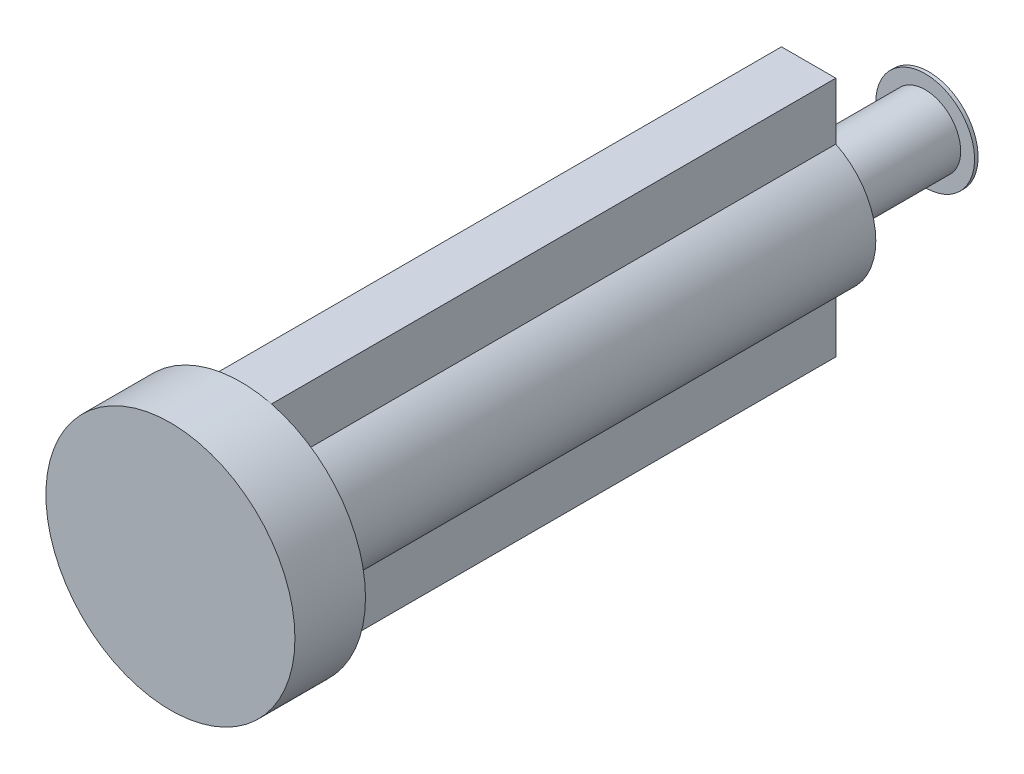
ISO-10303-21;
HEADER;
FILE_DESCRIPTION(('STEP AP214'),'2;1');
FILE_NAME('part.step','',(''),(''),'','','');
FILE_SCHEMA(('AUTOMOTIVE_DESIGN { 1 0 10303 214 1 1 1 1 }'));
ENDSEC;
DATA;
#1=APPLICATION_CONTEXT('core data for automotive mechanical design processes');
#2=APPLICATION_PROTOCOL_DEFINITION('international standard','automotive_design',2000,#1);
#3=PRODUCT_CONTEXT('',#1,'mechanical');
#4=PRODUCT('Part','Part','',(#3));
#5=PRODUCT_RELATED_PRODUCT_CATEGORY('part','',(#4));
#6=PRODUCT_DEFINITION_FORMATION('','',#4);
#7=PRODUCT_DEFINITION_CONTEXT('part definition',#1,'design');
#8=PRODUCT_DEFINITION('design','',#6,#7);
#9=PRODUCT_DEFINITION_SHAPE('','',#8);
#10=(LENGTH_UNIT() NAMED_UNIT(*) SI_UNIT(.MILLI.,.METRE.));
#11=(NAMED_UNIT(*) PLANE_ANGLE_UNIT() SI_UNIT($,.RADIAN.));
#12=(NAMED_UNIT(*) SI_UNIT($,.STERADIAN.) SOLID_ANGLE_UNIT());
#13=UNCERTAINTY_MEASURE_WITH_UNIT(LENGTH_MEASURE(1.E-05),#10,'distance_accuracy_value','');
#14=(GEOMETRIC_REPRESENTATION_CONTEXT(3) GLOBAL_UNCERTAINTY_ASSIGNED_CONTEXT((#13)) GLOBAL_UNIT_ASSIGNED_CONTEXT((#10,
#11,#12)) REPRESENTATION_CONTEXT('',''));
#15=CARTESIAN_POINT('',(0.,0.,0.));
#16=DIRECTION('',(0.,0.,1.));
#17=DIRECTION('',(1.,0.,0.));
#18=AXIS2_PLACEMENT_3D('',#15,#16,#17);
#19=CARTESIAN_POINT('',(-3.37132085295052,17.1145735807025,80.));
#20=DIRECTION('',(1.,0.,0.));
#21=DIRECTION('',(0.,0.,-1.));
#22=AXIS2_PLACEMENT_3D('',#19,#20,#21);
#23=PLANE('',#22);
#24=DIRECTION('',(0.,-1.,0.));
#25=VECTOR('',#24,1.);
#26=CARTESIAN_POINT('',(-3.37132085295052,17.1145735807025,0.));
#27=LINE('',#26,#25);
#28=CARTESIAN_POINT('',(-3.37132085295052,17.1145735807025,0.));
#29=VERTEX_POINT('',#28);
#30=CARTESIAN_POINT('',(-3.37132085295052,9.41457358070247,0.));
#31=VERTEX_POINT('',#30);
#32=EDGE_CURVE('E156',#29,#31,#27,.T.);
#33=ORIENTED_EDGE('',*,*,#32,.T.);
#34=DIRECTION('',(0.,0.,-1.));
#35=VECTOR('',#34,1.);
#36=CARTESIAN_POINT('',(-3.37132085295052,9.41457358070247,80.));
#37=LINE('',#36,#35);
#38=CARTESIAN_POINT('',(-3.37132085295052,9.41457358070247,80.));
#39=VERTEX_POINT('',#38);
#40=EDGE_CURVE('E48',#39,#31,#37,.T.);
#41=ORIENTED_EDGE('',*,*,#40,.F.);
#42=DIRECTION('',(0.,-1.,0.));
#43=VECTOR('',#42,1.);
#44=CARTESIAN_POINT('',(-3.37132085295052,17.1145735807025,80.));
#45=LINE('',#44,#43);
#46=CARTESIAN_POINT('',(-3.37132085295052,17.1145735807025,80.));
#47=VERTEX_POINT('',#46);
#48=EDGE_CURVE('E179',#47,#39,#45,.T.);
#49=ORIENTED_EDGE('',*,*,#48,.F.);
#50=DIRECTION('',(0.,0.,-1.));
#51=VECTOR('',#50,1.);
#52=CARTESIAN_POINT('',(-3.37132085295052,17.1145735807025,80.));
#53=LINE('',#52,#51);
#54=EDGE_CURVE('E155',#47,#29,#53,.T.);
#55=ORIENTED_EDGE('',*,*,#54,.T.);
#56=EDGE_LOOP('',(#33,#41,#49,#55));
#57=FACE_BOUND('',#56,.T.);
#58=ADVANCED_FACE('F39',(#57),#23,.F.);
#59=CARTESIAN_POINT('',(0.,0.,80.));
#60=DIRECTION('',(0.,0.,-1.));
#61=DIRECTION('',(-1.,0.,0.));
#62=AXIS2_PLACEMENT_3D('',#59,#60,#61);
#63=CYLINDRICAL_SURFACE('',#62,10.);
#64=CARTESIAN_POINT('',(0.,0.,0.));
#65=DIRECTION('',(0.,0.,1.));
#66=DIRECTION('',(1.,0.,0.));
#67=AXIS2_PLACEMENT_3D('',#64,#65,#66);
#68=CIRCLE('',#67,10.);
#69=CARTESIAN_POINT('',(-3.37132085295052,-9.41457358070247,0.));
#70=VERTEX_POINT('',#69);
#71=EDGE_CURVE('E160',#31,#70,#68,.T.);
#72=ORIENTED_EDGE('',*,*,#71,.T.);
#73=DIRECTION('',(0.,0.,-1.));
#74=VECTOR('',#73,1.);
#75=CARTESIAN_POINT('',(-3.37132085295052,-9.41457358070247,80.));
#76=LINE('',#75,#74);
#77=CARTESIAN_POINT('',(-3.37132085295052,-9.41457358070247,80.));
#78=VERTEX_POINT('',#77);
#79=EDGE_CURVE('E192',#78,#70,#76,.T.);
#80=ORIENTED_EDGE('',*,*,#79,.F.);
#81=CARTESIAN_POINT('',(0.,0.,80.));
#82=DIRECTION('',(0.,0.,1.));
#83=DIRECTION('',(1.,0.,0.));
#84=AXIS2_PLACEMENT_3D('',#81,#82,#83);
#85=CIRCLE('',#84,10.);
#86=EDGE_CURVE('E99',#39,#78,#85,.T.);
#87=ORIENTED_EDGE('',*,*,#86,.F.);
#88=ORIENTED_EDGE('',*,*,#40,.T.);
#89=EDGE_LOOP('',(#72,#80,#87,#88));
#90=FACE_BOUND('',#89,.T.);
#91=ADVANCED_FACE('F196',(#90),#63,.T.);
#92=CARTESIAN_POINT('',(-3.37132085295052,-9.41457358070247,80.));
#93=DIRECTION('',(1.,0.,0.));
#94=DIRECTION('',(0.,0.,-1.));
#95=AXIS2_PLACEMENT_3D('',#92,#93,#94);
#96=PLANE('',#95);
#97=DIRECTION('',(0.,-1.,0.));
#98=VECTOR('',#97,1.);
#99=CARTESIAN_POINT('',(-3.37132085295052,-9.41457358070247,0.));
#100=LINE('',#99,#98);
#101=CARTESIAN_POINT('',(-3.37132085295052,-17.1145735807025,0.));
#102=VERTEX_POINT('',#101);
#103=EDGE_CURVE('E164',#70,#102,#100,.T.);
#104=ORIENTED_EDGE('',*,*,#103,.T.);
#105=DIRECTION('',(0.,0.,-1.));
#106=VECTOR('',#105,1.);
#107=CARTESIAN_POINT('',(-3.37132085295052,-17.1145735807025,80.));
#108=LINE('',#107,#106);
#109=CARTESIAN_POINT('',(-3.37132085295052,-17.1145735807025,80.));
#110=VERTEX_POINT('',#109);
#111=EDGE_CURVE('E188',#110,#102,#108,.T.);
#112=ORIENTED_EDGE('',*,*,#111,.F.);
#113=DIRECTION('',(0.,-1.,0.));
#114=VECTOR('',#113,1.);
#115=CARTESIAN_POINT('',(-3.37132085295052,-9.41457358070247,80.));
#116=LINE('',#115,#114);
#117=EDGE_CURVE('E145',#78,#110,#116,.T.);
#118=ORIENTED_EDGE('',*,*,#117,.F.);
#119=ORIENTED_EDGE('',*,*,#79,.T.);
#120=EDGE_LOOP('',(#104,#112,#118,#119));
#121=FACE_BOUND('',#120,.T.);
#122=ADVANCED_FACE('F206',(#121),#96,.F.);
#123=CARTESIAN_POINT('',(-3.37132085295052,-17.1145735807025,80.));
#124=DIRECTION('',(0.,1.,0.));
#125=DIRECTION('',(0.,0.,1.));
#126=AXIS2_PLACEMENT_3D('',#123,#124,#125);
#127=PLANE('',#126);
#128=DIRECTION('',(1.,0.,0.));
#129=VECTOR('',#128,1.);
#130=CARTESIAN_POINT('',(-3.37132085295052,-17.1145735807025,0.));
#131=LINE('',#130,#129);
#132=CARTESIAN_POINT('',(4.32867914704948,-17.1145735807025,0.));
#133=VERTEX_POINT('',#132);
#134=EDGE_CURVE('E167',#102,#133,#131,.T.);
#135=ORIENTED_EDGE('',*,*,#134,.T.);
#136=DIRECTION('',(0.,0.,-1.));
#137=VECTOR('',#136,1.);
#138=CARTESIAN_POINT('',(4.32867914704948,-17.1145735807025,80.));
#139=LINE('',#138,#137);
#140=CARTESIAN_POINT('',(4.32867914704948,-17.1145735807025,80.));
#141=VERTEX_POINT('',#140);
#142=EDGE_CURVE('E125',#141,#133,#139,.T.);
#143=ORIENTED_EDGE('',*,*,#142,.F.);
#144=DIRECTION('',(1.,0.,0.));
#145=VECTOR('',#144,1.);
#146=CARTESIAN_POINT('',(-3.37132085295052,-17.1145735807025,80.));
#147=LINE('',#146,#145);
#148=EDGE_CURVE('E142',#110,#141,#147,.T.);
#149=ORIENTED_EDGE('',*,*,#148,.F.);
#150=ORIENTED_EDGE('',*,*,#111,.T.);
#151=EDGE_LOOP('',(#135,#143,#149,#150));
#152=FACE_BOUND('',#151,.T.);
#153=ADVANCED_FACE('F210',(#152),#127,.F.);
#154=CARTESIAN_POINT('',(4.32867914704948,-9.01457358070247,80.));
#155=DIRECTION('',(-1.,0.,0.));
#156=DIRECTION('',(0.,0.,1.));
#157=AXIS2_PLACEMENT_3D('',#154,#155,#156);
#158=PLANE('',#157);
#159=DIRECTION('',(0.,1.,0.));
#160=VECTOR('',#159,1.);
#161=CARTESIAN_POINT('',(4.32867914704948,-9.01457358070247,0.));
#162=LINE('',#161,#160);
#163=CARTESIAN_POINT('',(4.32867914704948,-9.01457358070247,0.));
#164=VERTEX_POINT('',#163);
#165=EDGE_CURVE('E121',#133,#164,#162,.T.);
#166=ORIENTED_EDGE('',*,*,#165,.T.);
#167=DIRECTION('',(0.,0.,-1.));
#168=VECTOR('',#167,1.);
#169=CARTESIAN_POINT('',(4.32867914704948,-9.01457358070247,80.));
#170=LINE('',#169,#168);
#171=CARTESIAN_POINT('',(4.32867914704948,-9.01457358070247,80.));
#172=VERTEX_POINT('',#171);
#173=EDGE_CURVE('E113',#172,#164,#170,.T.);
#174=ORIENTED_EDGE('',*,*,#173,.F.);
#175=DIRECTION('',(0.,1.,0.));
#176=VECTOR('',#175,1.);
#177=CARTESIAN_POINT('',(4.32867914704948,-9.01457358070247,80.));
#178=LINE('',#177,#176);
#179=EDGE_CURVE('E118',#141,#172,#178,.T.);
#180=ORIENTED_EDGE('',*,*,#179,.F.);
#181=ORIENTED_EDGE('',*,*,#142,.T.);
#182=EDGE_LOOP('',(#166,#174,#180,#181));
#183=FACE_BOUND('',#182,.T.);
#184=ADVANCED_FACE('F115',(#183),#158,.F.);
#185=CARTESIAN_POINT('',(0.,0.,80.));
#186=DIRECTION('',(0.,0.,-1.));
#187=DIRECTION('',(-1.,0.,0.));
#188=AXIS2_PLACEMENT_3D('',#185,#186,#187);
#189=CYLINDRICAL_SURFACE('',#188,10.);
#190=CARTESIAN_POINT('',(0.,0.,0.));
#191=DIRECTION('',(0.,0.,1.));
#192=DIRECTION('',(1.,0.,0.));
#193=AXIS2_PLACEMENT_3D('',#190,#191,#192);
#194=CIRCLE('',#193,10.);
#195=CARTESIAN_POINT('',(4.32867914704948,9.01457358070247,0.));
#196=VERTEX_POINT('',#195);
#197=EDGE_CURVE('E172',#164,#196,#194,.T.);
#198=ORIENTED_EDGE('',*,*,#197,.T.);
#199=DIRECTION('',(0.,0.,-1.));
#200=VECTOR('',#199,1.);
#201=CARTESIAN_POINT('',(4.32867914704948,9.01457358070247,80.));
#202=LINE('',#201,#200);
#203=CARTESIAN_POINT('',(4.32867914704948,9.01457358070247,80.));
#204=VERTEX_POINT('',#203);
#205=EDGE_CURVE('E126',#204,#196,#202,.T.);
#206=ORIENTED_EDGE('',*,*,#205,.F.);
#207=CARTESIAN_POINT('',(0.,0.,80.));
#208=DIRECTION('',(0.,0.,1.));
#209=DIRECTION('',(1.,0.,0.));
#210=AXIS2_PLACEMENT_3D('',#207,#208,#209);
#211=CIRCLE('',#210,10.);
#212=EDGE_CURVE('E129',#172,#204,#211,.T.);
#213=ORIENTED_EDGE('',*,*,#212,.F.);
#214=ORIENTED_EDGE('',*,*,#173,.T.);
#215=EDGE_LOOP('',(#198,#206,#213,#214));
#216=FACE_BOUND('',#215,.T.);
#217=ADVANCED_FACE('F130',(#216),#189,.T.);
#218=CARTESIAN_POINT('',(4.32867914704948,17.1145735807025,80.));
#219=DIRECTION('',(-1.,0.,0.));
#220=DIRECTION('',(0.,0.,1.));
#221=AXIS2_PLACEMENT_3D('',#218,#219,#220);
#222=PLANE('',#221);
#223=DIRECTION('',(0.,1.,0.));
#224=VECTOR('',#223,1.);
#225=CARTESIAN_POINT('',(4.32867914704948,17.1145735807025,0.));
#226=LINE('',#225,#224);
#227=CARTESIAN_POINT('',(4.32867914704948,17.1145735807025,0.));
#228=VERTEX_POINT('',#227);
#229=EDGE_CURVE('E84',#196,#228,#226,.T.);
#230=ORIENTED_EDGE('',*,*,#229,.T.);
#231=DIRECTION('',(0.,0.,-1.));
#232=VECTOR('',#231,1.);
#233=CARTESIAN_POINT('',(4.32867914704948,17.1145735807025,80.));
#234=LINE('',#233,#232);
#235=CARTESIAN_POINT('',(4.32867914704948,17.1145735807025,80.));
#236=VERTEX_POINT('',#235);
#237=EDGE_CURVE('E56',#236,#228,#234,.T.);
#238=ORIENTED_EDGE('',*,*,#237,.F.);
#239=DIRECTION('',(0.,1.,0.));
#240=VECTOR('',#239,1.);
#241=CARTESIAN_POINT('',(4.32867914704948,17.1145735807025,80.));
#242=LINE('',#241,#240);
#243=EDGE_CURVE('E134',#204,#236,#242,.T.);
#244=ORIENTED_EDGE('',*,*,#243,.F.);
#245=ORIENTED_EDGE('',*,*,#205,.T.);
#246=EDGE_LOOP('',(#230,#238,#244,#245));
#247=FACE_BOUND('',#246,.T.);
#248=ADVANCED_FACE('F272',(#247),#222,.F.);
#249=CARTESIAN_POINT('',(-3.37132085295052,17.1145735807025,80.));
#250=DIRECTION('',(0.,-1.,0.));
#251=DIRECTION('',(0.,0.,-1.));
#252=AXIS2_PLACEMENT_3D('',#249,#250,#251);
#253=PLANE('',#252);
#254=DIRECTION('',(-1.,0.,0.));
#255=VECTOR('',#254,1.);
#256=CARTESIAN_POINT('',(-3.37132085295052,17.1145735807025,0.));
#257=LINE('',#256,#255);
#258=EDGE_CURVE('E90',#228,#29,#257,.T.);
#259=ORIENTED_EDGE('',*,*,#258,.T.);
#260=ORIENTED_EDGE('',*,*,#54,.F.);
#261=DIRECTION('',(-1.,0.,0.));
#262=VECTOR('',#261,1.);
#263=CARTESIAN_POINT('',(-3.37132085295052,17.1145735807025,80.));
#264=LINE('',#263,#262);
#265=EDGE_CURVE('E151',#236,#47,#264,.T.);
#266=ORIENTED_EDGE('',*,*,#265,.F.);
#267=ORIENTED_EDGE('',*,*,#237,.T.);
#268=EDGE_LOOP('',(#259,#260,#266,#267));
#269=FACE_BOUND('',#268,.T.);
#270=ADVANCED_FACE('F275',(#269),#253,.F.);
#271=CARTESIAN_POINT('',(0.,0.,0.));
#272=DIRECTION('',(0.,0.,1.));
#273=DIRECTION('',(1.,0.,0.));
#274=AXIS2_PLACEMENT_3D('',#271,#272,#273);
#275=PLANE('',#274);
#276=CARTESIAN_POINT('',(0.,0.,0.));
#277=DIRECTION('',(0.,0.,1.));
#278=DIRECTION('',(1.,0.,0.));
#279=AXIS2_PLACEMENT_3D('',#276,#277,#278);
#280=CIRCLE('',#279,5.03497873830572);
#281=CARTESIAN_POINT('',(5.03497873830572,0.,0.));
#282=VERTEX_POINT('',#281);
#283=EDGE_CURVE('E11',#282,#282,#280,.F.);
#284=ORIENTED_EDGE('',*,*,#283,.F.);
#285=EDGE_LOOP('',(#284));
#286=FACE_BOUND('',#285,.T.);
#287=ORIENTED_EDGE('',*,*,#32,.F.);
#288=ORIENTED_EDGE('',*,*,#258,.F.);
#289=ORIENTED_EDGE('',*,*,#229,.F.);
#290=ORIENTED_EDGE('',*,*,#197,.F.);
#291=ORIENTED_EDGE('',*,*,#165,.F.);
#292=ORIENTED_EDGE('',*,*,#134,.F.);
#293=ORIENTED_EDGE('',*,*,#103,.F.);
#294=ORIENTED_EDGE('',*,*,#71,.F.);
#295=EDGE_LOOP('',(#287,#288,#289,#290,#291,#292,#293,#294));
#296=FACE_BOUND('',#295,.T.);
#297=ADVANCED_FACE('F202',(#286,#296),#275,.F.);
#298=CARTESIAN_POINT('',(0.,0.,80.));
#299=DIRECTION('',(0.,0.,1.));
#300=DIRECTION('',(1.,0.,0.));
#301=AXIS2_PLACEMENT_3D('',#298,#299,#300);
#302=PLANE('',#301);
#303=ORIENTED_EDGE('',*,*,#265,.T.);
#304=ORIENTED_EDGE('',*,*,#48,.T.);
#305=ORIENTED_EDGE('',*,*,#86,.T.);
#306=ORIENTED_EDGE('',*,*,#117,.T.);
#307=ORIENTED_EDGE('',*,*,#148,.T.);
#308=CARTESIAN_POINT('',(0.,0.,80.));
#309=DIRECTION('',(0.,0.,1.));
#310=DIRECTION('',(1.,0.,0.));
#311=AXIS2_PLACEMENT_3D('',#308,#309,#310);
#312=CIRCLE('',#311,17.6535008428181);
#313=EDGE_CURVE('E221',#236,#141,#312,.T.);
#314=ORIENTED_EDGE('',*,*,#313,.F.);
#315=EDGE_LOOP('',(#303,#304,#305,#306,#307,#314));
#316=FACE_BOUND('',#315,.T.);
#317=ADVANCED_FACE('F214',(#316),#302,.F.);
#318=CARTESIAN_POINT('',(0.,0.,90.));
#319=DIRECTION('',(0.,0.,-1.));
#320=DIRECTION('',(-1.,0.,0.));
#321=AXIS2_PLACEMENT_3D('',#318,#319,#320);
#322=CYLINDRICAL_SURFACE('',#321,17.6535008428181);
#323=CARTESIAN_POINT('',(0.,0.,90.));
#324=DIRECTION('',(0.,0.,1.));
#325=DIRECTION('',(1.,0.,0.));
#326=AXIS2_PLACEMENT_3D('',#323,#324,#325);
#327=CIRCLE('',#326,17.6535008428181);
#328=CARTESIAN_POINT('',(17.6535008428181,0.,90.));
#329=VERTEX_POINT('',#328);
#330=EDGE_CURVE('E161',#329,#329,#327,.T.);
#331=ORIENTED_EDGE('',*,*,#330,.F.);
#332=EDGE_LOOP('',(#331));
#333=FACE_BOUND('',#332,.T.);
#334=ORIENTED_EDGE('',*,*,#313,.T.);
#335=EDGE_CURVE('E139',#141,#236,#312,.T.);
#336=ORIENTED_EDGE('',*,*,#335,.T.);
#337=EDGE_LOOP('',(#334,#336));
#338=FACE_BOUND('',#337,.T.);
#339=ADVANCED_FACE('F281',(#333,#338),#322,.T.);
#340=CARTESIAN_POINT('',(0.,0.,90.));
#341=DIRECTION('',(0.,0.,1.));
#342=DIRECTION('',(1.,0.,0.));
#343=AXIS2_PLACEMENT_3D('',#340,#341,#342);
#344=PLANE('',#343);
#345=ORIENTED_EDGE('',*,*,#330,.T.);
#346=EDGE_LOOP('',(#345));
#347=FACE_BOUND('',#346,.T.);
#348=ADVANCED_FACE('F284',(#347),#344,.T.);
#349=ORIENTED_EDGE('',*,*,#335,.F.);
#350=ORIENTED_EDGE('',*,*,#179,.T.);
#351=ORIENTED_EDGE('',*,*,#212,.T.);
#352=ORIENTED_EDGE('',*,*,#243,.T.);
#353=EDGE_LOOP('',(#349,#350,#351,#352));
#354=FACE_BOUND('',#353,.T.);
#355=ADVANCED_FACE('F137',(#354),#302,.F.);
#356=CARTESIAN_POINT('',(0.,0.,-17.));
#357=DIRECTION('',(0.,0.,1.));
#358=DIRECTION('',(1.,0.,0.));
#359=AXIS2_PLACEMENT_3D('',#356,#357,#358);
#360=CYLINDRICAL_SURFACE('',#359,5.03497873830572);
#361=CARTESIAN_POINT('',(0.,0.,-17.));
#362=DIRECTION('',(0.,0.,-1.));
#363=DIRECTION('',(-1.,0.,0.));
#364=AXIS2_PLACEMENT_3D('',#361,#362,#363);
#365=CIRCLE('',#364,5.03497873830572);
#366=CARTESIAN_POINT('',(-5.03497873830572,0.,-17.));
#367=VERTEX_POINT('',#366);
#368=EDGE_CURVE('E227',#367,#367,#365,.T.);
#369=ORIENTED_EDGE('',*,*,#368,.F.);
#370=EDGE_LOOP('',(#369));
#371=FACE_BOUND('',#370,.T.);
#372=ORIENTED_EDGE('',*,*,#283,.T.);
#373=EDGE_LOOP('',(#372));
#374=FACE_BOUND('',#373,.T.);
#375=ADVANCED_FACE('F245',(#371,#374),#360,.T.);
#376=CARTESIAN_POINT('',(0.,0.,-17.5));
#377=DIRECTION('',(0.,0.,1.));
#378=DIRECTION('',(1.,0.,0.));
#379=AXIS2_PLACEMENT_3D('',#376,#377,#378);
#380=CYLINDRICAL_SURFACE('',#379,7.);
#381=CARTESIAN_POINT('',(0.,0.,-17.5));
#382=DIRECTION('',(0.,0.,-1.));
#383=DIRECTION('',(-1.,0.,0.));
#384=AXIS2_PLACEMENT_3D('',#381,#382,#383);
#385=CIRCLE('',#384,7.);
#386=CARTESIAN_POINT('',(-7.,0.,-17.5));
#387=VERTEX_POINT('',#386);
#388=EDGE_CURVE('E231',#387,#387,#385,.T.);
#389=ORIENTED_EDGE('',*,*,#388,.F.);
#390=EDGE_LOOP('',(#389));
#391=FACE_BOUND('',#390,.T.);
#392=CARTESIAN_POINT('',(0.,0.,-17.));
#393=DIRECTION('',(0.,0.,-1.));
#394=DIRECTION('',(-1.,0.,0.));
#395=AXIS2_PLACEMENT_3D('',#392,#393,#394);
#396=CIRCLE('',#395,7.);
#397=CARTESIAN_POINT('',(-7.,0.,-17.));
#398=VERTEX_POINT('',#397);
#399=EDGE_CURVE('E232',#398,#398,#396,.T.);
#400=ORIENTED_EDGE('',*,*,#399,.T.);
#401=EDGE_LOOP('',(#400));
#402=FACE_BOUND('',#401,.T.);
#403=ADVANCED_FACE('F242',(#391,#402),#380,.T.);
#404=CARTESIAN_POINT('',(0.,0.,-17.5));
#405=DIRECTION('',(0.,0.,-1.));
#406=DIRECTION('',(-1.,0.,0.));
#407=AXIS2_PLACEMENT_3D('',#404,#405,#406);
#408=PLANE('',#407);
#409=ORIENTED_EDGE('',*,*,#388,.T.);
#410=EDGE_LOOP('',(#409));
#411=FACE_BOUND('',#410,.T.);
#412=ADVANCED_FACE('F240',(#411),#408,.T.);
#413=CARTESIAN_POINT('',(0.,0.,-17.));
#414=DIRECTION('',(0.,0.,-1.));
#415=DIRECTION('',(-1.,0.,0.));
#416=AXIS2_PLACEMENT_3D('',#413,#414,#415);
#417=PLANE('',#416);
#418=ORIENTED_EDGE('',*,*,#368,.T.);
#419=EDGE_LOOP('',(#418));
#420=FACE_BOUND('',#419,.T.);
#421=ORIENTED_EDGE('',*,*,#399,.F.);
#422=EDGE_LOOP('',(#421));
#423=FACE_BOUND('',#422,.T.);
#424=ADVANCED_FACE('F249',(#420,#423),#417,.F.);
#425=CLOSED_SHELL('',(#58,#91,#122,#153,#184,#217,#248,#270,#297,#317,#339,#348,#355,#375,#403,
#412,#424));
#426=MANIFOLD_SOLID_BREP('B2',#425);
#427=ADVANCED_BREP_SHAPE_REPRESENTATION('',(#18,#426),#14);
#428=SHAPE_DEFINITION_REPRESENTATION(#9,#427);
ENDSEC;
END-ISO-10303-21;
